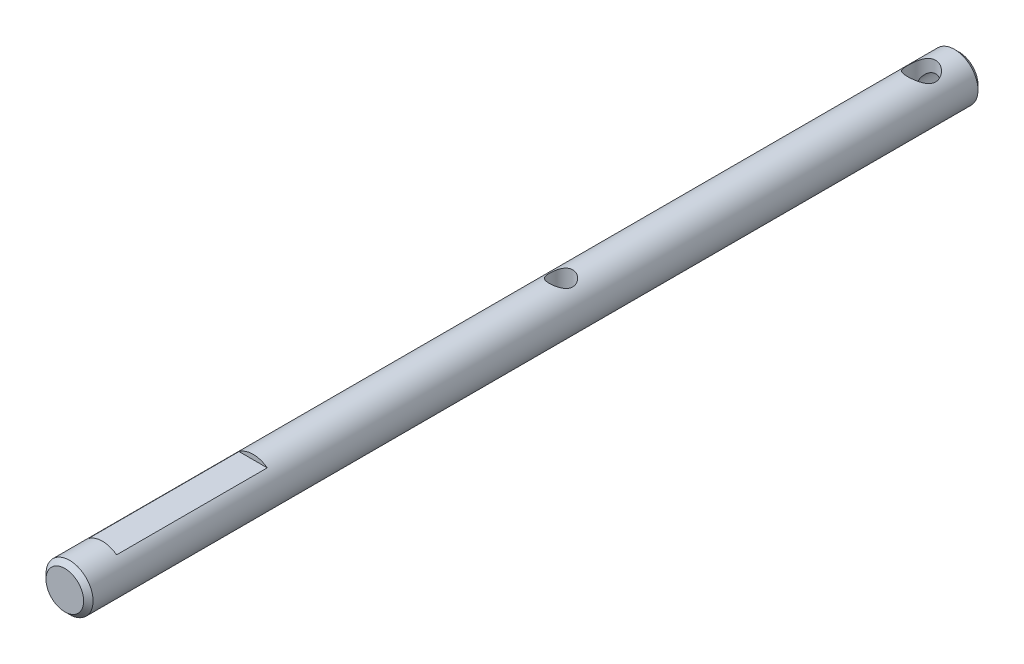
ISO-10303-21;
HEADER;
FILE_DESCRIPTION(('STEP AP214'),'2;1');
FILE_NAME('part.step','',(''),(''),'','','');
FILE_SCHEMA(('AUTOMOTIVE_DESIGN { 1 0 10303 214 1 1 1 1 }'));
ENDSEC;
DATA;
#1=APPLICATION_CONTEXT('core data for automotive mechanical design processes');
#2=APPLICATION_PROTOCOL_DEFINITION('international standard','automotive_design',2000,#1);
#3=PRODUCT_CONTEXT('',#1,'mechanical');
#4=PRODUCT('Part','Part','',(#3));
#5=PRODUCT_RELATED_PRODUCT_CATEGORY('part','',(#4));
#6=PRODUCT_DEFINITION_FORMATION('','',#4);
#7=PRODUCT_DEFINITION_CONTEXT('part definition',#1,'design');
#8=PRODUCT_DEFINITION('design','',#6,#7);
#9=PRODUCT_DEFINITION_SHAPE('','',#8);
#10=(LENGTH_UNIT() NAMED_UNIT(*) SI_UNIT(.MILLI.,.METRE.));
#11=(NAMED_UNIT(*) PLANE_ANGLE_UNIT() SI_UNIT($,.RADIAN.));
#12=(NAMED_UNIT(*) SI_UNIT($,.STERADIAN.) SOLID_ANGLE_UNIT());
#13=UNCERTAINTY_MEASURE_WITH_UNIT(LENGTH_MEASURE(1.E-05),#10,'distance_accuracy_value','');
#14=(GEOMETRIC_REPRESENTATION_CONTEXT(3) GLOBAL_UNCERTAINTY_ASSIGNED_CONTEXT((#13)) GLOBAL_UNIT_ASSIGNED_CONTEXT((#10,
#11,#12)) REPRESENTATION_CONTEXT('',''));
#15=CARTESIAN_POINT('',(0.,0.,0.));
#16=DIRECTION('',(0.,0.,1.));
#17=DIRECTION('',(1.,0.,0.));
#18=AXIS2_PLACEMENT_3D('',#15,#16,#17);
#19=CARTESIAN_POINT('',(0.,0.,0.));
#20=DIRECTION('',(0.,0.,1.));
#21=DIRECTION('',(1.,0.,0.));
#22=AXIS2_PLACEMENT_3D('',#19,#20,#21);
#23=PLANE('',#22);
#24=CARTESIAN_POINT('',(0.,0.,0.));
#25=DIRECTION('',(0.,0.,1.));
#26=DIRECTION('',(1.,0.,0.));
#27=AXIS2_PLACEMENT_3D('',#24,#25,#26);
#28=CIRCLE('',#27,2.);
#29=CARTESIAN_POINT('',(2.,0.,0.));
#30=VERTEX_POINT('',#29);
#31=EDGE_CURVE('E152',#30,#30,#28,.F.);
#32=ORIENTED_EDGE('',*,*,#31,.T.);
#33=EDGE_LOOP('',(#32));
#34=FACE_BOUND('',#33,.T.);
#35=CARTESIAN_POINT('',(0.,0.,0.));
#36=DIRECTION('',(0.,0.,-1.));
#37=DIRECTION('',(-1.,0.,0.));
#38=AXIS2_PLACEMENT_3D('',#35,#36,#37);
#39=CIRCLE('',#38,1.25);
#40=CARTESIAN_POINT('',(-1.25,0.,0.));
#41=VERTEX_POINT('',#40);
#42=EDGE_CURVE('E79',#41,#41,#39,.T.);
#43=ORIENTED_EDGE('',*,*,#42,.F.);
#44=EDGE_LOOP('',(#43));
#45=FACE_BOUND('',#44,.T.);
#46=ADVANCED_FACE('F37',(#34,#45),#23,.F.);
#47=CARTESIAN_POINT('',(0.,0.,95.));
#48=DIRECTION('',(0.,0.,-1.));
#49=DIRECTION('',(-1.,0.,0.));
#50=AXIS2_PLACEMENT_3D('',#47,#48,#49);
#51=CYLINDRICAL_SURFACE('',#50,2.5);
#52=CARTESIAN_POINT('',(0.,-2.5,43.55));
#53=CARTESIAN_POINT('',(0.0657149536912378,-2.49999641755188,43.5499958721006));
#54=CARTESIAN_POINT('',(0.131508249622545,-2.49738113774397,43.5447874085979));
#55=CARTESIAN_POINT('',(0.261150294085535,-2.48717695046745,43.5241838995738));
#56=CARTESIAN_POINT('',(0.324995108391883,-2.47957859786229,43.5087695087529));
#57=CARTESIAN_POINT('',(0.448666931100721,-2.46020349254139,43.468507739229));
#58=CARTESIAN_POINT('',(0.508508503673978,-2.448442989719,43.44369701969));
#59=CARTESIAN_POINT('',(0.623090771008207,-2.42182220644723,43.3855367232938));
#60=CARTESIAN_POINT('',(0.677831867487562,-2.40696217041912,43.3521878196889));
#61=CARTESIAN_POINT('',(0.784384772202399,-2.37445322822571,43.2756034381434));
#62=CARTESIAN_POINT('',(0.835819013902641,-2.3566899890942,43.2318919009504));
#63=CARTESIAN_POINT('',(0.930974306083723,-2.3207496280843,43.1368481509412));
#64=CARTESIAN_POINT('',(0.974689478883457,-2.30257220261294,43.0855101852844));
#65=CARTESIAN_POINT('',(1.05656500056285,-2.26623688996684,42.9718958130958));
#66=CARTESIAN_POINT('',(1.09403166943955,-2.24818983712665,42.9090798770676));
#67=CARTESIAN_POINT('',(1.15771028361337,-2.21607473465401,42.7770408300172));
#68=CARTESIAN_POINT('',(1.18393026870792,-2.20200384508737,42.7078223390966));
#69=CARTESIAN_POINT('',(1.22266555273573,-2.18072333797261,42.5691686182226));
#70=CARTESIAN_POINT('',(1.23590732135055,-2.17315339479642,42.4999944349157));
#71=CARTESIAN_POINT('',(1.25053374163606,-2.1647736243566,42.3600264527756));
#72=CARTESIAN_POINT('',(1.25193011046634,-2.1639571167911,42.289234323911));
#73=CARTESIAN_POINT('',(1.24335910896537,-2.16888662821561,42.1571424696058));
#74=CARTESIAN_POINT('',(1.23473069942102,-2.17385954577517,42.0957199609712));
#75=CARTESIAN_POINT('',(1.20867481132116,-2.18845285917313,41.9753476132837));
#76=CARTESIAN_POINT('',(1.19124452987206,-2.1980747353972,41.9163985683684));
#77=CARTESIAN_POINT('',(1.1477622254825,-2.22109345515926,41.8009635842929));
#78=CARTESIAN_POINT('',(1.12151883389499,-2.23457300829998,41.7445670015178));
#79=CARTESIAN_POINT('',(1.061302109585,-2.26379255351755,41.6367071342625));
#80=CARTESIAN_POINT('',(1.02732530476558,-2.27953355975238,41.5852460804999));
#81=CARTESIAN_POINT('',(0.947582568640984,-2.31391447379107,41.481848434071));
#82=CARTESIAN_POINT('',(0.900868072961601,-2.33266887795933,41.4306789080298));
#83=CARTESIAN_POINT('',(0.799444473426717,-2.36934529125509,41.3365807267614));
#84=CARTESIAN_POINT('',(0.744731570717859,-2.38726689948501,41.2936560099576));
#85=CARTESIAN_POINT('',(0.625645632289814,-2.42127484103705,41.2153929237128));
#86=CARTESIAN_POINT('',(0.560941989499263,-2.43723730202509,41.1804994094428));
#87=CARTESIAN_POINT('',(0.425582769360998,-2.46447351401553,41.1223787136962));
#88=CARTESIAN_POINT('',(0.354931970331598,-2.47575098679441,41.099142268731));
#89=CARTESIAN_POINT('',(0.21595811457588,-2.49155417176795,41.0669057453542));
#90=CARTESIAN_POINT('',(0.147926913185408,-2.4965617287664,41.0568859553165));
#91=CARTESIAN_POINT('',(0.0109744999366958,-2.50091266823877,41.0481690860819));
#92=CARTESIAN_POINT('',(-0.0579462748373724,-2.5002587340164,41.0494666429506));
#93=CARTESIAN_POINT('',(-0.189041214982487,-2.49363990316801,41.0627583605234));
#94=CARTESIAN_POINT('',(-0.251324260062437,-2.48809057110237,41.0739156659125));
#95=CARTESIAN_POINT('',(-0.37300861537739,-2.47277714143524,41.1052975898689));
#96=CARTESIAN_POINT('',(-0.43240960711374,-2.46301257917916,41.1255232080667));
#97=CARTESIAN_POINT('',(-0.548610760562076,-2.43980314267087,41.1749980830415));
#98=CARTESIAN_POINT('',(-0.605287996257686,-2.42626102212424,41.204488812646));
#99=CARTESIAN_POINT('',(-0.713076702123644,-2.39679967896386,41.2713844195576));
#100=CARTESIAN_POINT('',(-0.764185787219095,-2.38087944457232,41.3087926682418));
#101=CARTESIAN_POINT('',(-0.86470961161331,-2.34635276671831,41.3947005316661));
#102=CARTESIAN_POINT('',(-0.913465097280793,-2.32763606060552,41.443928585567));
#103=CARTESIAN_POINT('',(-1.00232040139154,-2.29077989504843,41.5499064390866));
#104=CARTESIAN_POINT('',(-1.04241423211354,-2.27264084226908,41.6066613985205));
#105=CARTESIAN_POINT('',(-1.11463489312211,-2.23813990282585,41.7295545677504));
#106=CARTESIAN_POINT('',(-1.14628186984829,-2.2219066207934,41.7960140827607));
#107=CARTESIAN_POINT('',(-1.19760353251724,-2.19467590460158,41.9343875846156));
#108=CARTESIAN_POINT('',(-1.21729364485945,-2.18367172800773,42.0062944081265));
#109=CARTESIAN_POINT('',(-1.24232710931209,-2.16951876260834,42.1461377785768));
#110=CARTESIAN_POINT('',(-1.24886624550107,-2.16571729325615,42.2137928167863));
#111=CARTESIAN_POINT('',(-1.25086144297597,-2.16456693307719,42.3493088339634));
#112=CARTESIAN_POINT('',(-1.24632230828049,-2.16721524534441,42.4171697109243));
#113=CARTESIAN_POINT('',(-1.22740765699032,-2.17797327562532,42.544354376915));
#114=CARTESIAN_POINT('',(-1.21401039292849,-2.18553868102993,42.6038755876805));
#115=CARTESIAN_POINT('',(-1.17896919778079,-2.20463770234898,42.7197601492809));
#116=CARTESIAN_POINT('',(-1.15732261394975,-2.21617259462095,42.7761224776149));
#117=CARTESIAN_POINT('',(-1.10476968162584,-2.24285662955661,42.8882810637333));
#118=CARTESIAN_POINT('',(-1.07333892227056,-2.25819652995239,42.9437848772871));
#119=CARTESIAN_POINT('',(-1.00268871454578,-2.29044164543238,43.0490931702257));
#120=CARTESIAN_POINT('',(-0.963465214048295,-2.30734767243153,43.0988946631481));
#121=CARTESIAN_POINT('',(-0.872754158330786,-2.34327903949142,43.197677477947));
#122=CARTESIAN_POINT('',(-0.8203555287627,-2.36231229139336,43.2458238779524));
#123=CARTESIAN_POINT('',(-0.707693507775336,-2.3984719031886,43.3328287292795));
#124=CARTESIAN_POINT('',(-0.647425904070967,-2.4155972326005,43.3716821742828));
#125=CARTESIAN_POINT('',(-0.519914496024918,-2.44622511981379,43.4390454534527));
#126=CARTESIAN_POINT('',(-0.452624379918253,-2.45970120703636,43.4674802117643));
#127=CARTESIAN_POINT('',(-0.313427626617725,-2.48126676704332,43.5122602098987));
#128=CARTESIAN_POINT('',(-0.241534749528946,-2.48937154216165,43.528639808537));
#129=CARTESIAN_POINT('',(-0.14075243310422,-2.49619327387079,43.5423717638448));
#130=CARTESIAN_POINT('',(-0.112702349299365,-2.49761706674002,43.5452283010795));
#131=CARTESIAN_POINT('',(-0.0564396647589401,-2.49952121222331,43.549043331896));
#132=CARTESIAN_POINT('',(-0.0282270595592207,-2.50000153879704,43.550001773089));
#133=CARTESIAN_POINT('',(0.,-2.5,43.55));
#134=B_SPLINE_CURVE_WITH_KNOTS('',3,(#52,#53,#54,#55,#56,#57,#58,#59,#60,#61,#62,#63,#64,#65,
#66,#67,#68,#69,#70,#71,#72,#73,#74,#75,#76,#77,#78,#79,#80,#81,#82,#83,#84,#85,#86,#87,#88,#89,
#90,#91,#92,#93,#94,#95,#96,#97,#98,#99,#100,#101,#102,#103,#104,#105,#106,#107,#108,#109,#110,
#111,#112,#113,#114,#115,#116,#117,#118,#119,#120,#121,#122,#123,#124,#125,#126,#127,#128,#129,
#130,#131,#132,#133),.UNSPECIFIED.,.T.,.F.,(4,2,2,2,2,2,2,2,2,2,2,2,2,2,2,2,2,2,2,2,2,2,2,2,2,2,
2,2,2,2,2,2,2,2,2,2,2,2,2,2,4),(0.,0.197030321775364,0.394435187136495,0.59107769436537,
0.787704700726955,0.996227198397605,1.20490779706754,1.4297715803844,1.65447434872851,
1.86572515175286,2.07676696661275,2.2625714051165,2.44843504907096,2.63862800210608,
2.82890651575276,3.04331176667347,3.25781918248356,3.48228777768049,3.70657771140348,
3.9122911308918,4.11790705639343,4.3075863313265,4.49728652038662,4.69241070034871,
4.88761813435421,5.10199513305521,5.31651985769287,5.5414335269959,5.76605639925969,
5.96911634372964,6.17208824825003,6.35572412805224,6.53941910979594,6.73545570969515,
6.93159451423694,7.15156553440619,7.37165479220712,7.59330017078653,7.81431135781158,
7.89894100172118,7.98357298143554),.UNSPECIFIED.);
#135=CARTESIAN_POINT('',(0.,-2.5,43.55));
#136=VERTEX_POINT('',#135);
#137=EDGE_CURVE('E11',#136,#136,#134,.T.);
#138=ORIENTED_EDGE('',*,*,#137,.T.);
#139=EDGE_LOOP('',(#138));
#140=FACE_BOUND('',#139,.T.);
#141=CARTESIAN_POINT('',(0.,2.5,43.55));
#142=CARTESIAN_POINT('',(-0.0657149536912274,2.49999641755189,43.5499958721006));
#143=CARTESIAN_POINT('',(-0.131508249622534,2.49738113774397,43.5447874085979));
#144=CARTESIAN_POINT('',(-0.261150294085524,2.48717695046745,43.5241838995738));
#145=CARTESIAN_POINT('',(-0.324995108391872,2.47957859786229,43.5087695087529));
#146=CARTESIAN_POINT('',(-0.44866693110071,2.4602034925414,43.468507739229));
#147=CARTESIAN_POINT('',(-0.508508503673967,2.448442989719,43.44369701969));
#148=CARTESIAN_POINT('',(-0.623090771008197,2.42182220644723,43.3855367232938));
#149=CARTESIAN_POINT('',(-0.677831867487552,2.40696217041913,43.3521878196889));
#150=CARTESIAN_POINT('',(-0.784384772202387,2.37445322822572,43.2756034381434));
#151=CARTESIAN_POINT('',(-0.835819013902628,2.3566899890942,43.2318919009504));
#152=CARTESIAN_POINT('',(-0.93097430608371,2.32074962808431,43.1368481509412));
#153=CARTESIAN_POINT('',(-0.974689478883446,2.30257220261294,43.0855101852844));
#154=CARTESIAN_POINT('',(-1.05656500056284,2.26623688996684,42.9718958130958));
#155=CARTESIAN_POINT('',(-1.09403166943954,2.24818983712665,42.9090798770676));
#156=CARTESIAN_POINT('',(-1.15771028361336,2.21607473465401,42.7770408300172));
#157=CARTESIAN_POINT('',(-1.18393026870791,2.20200384508738,42.7078223390966));
#158=CARTESIAN_POINT('',(-1.22266555273572,2.18072333797261,42.5691686182226));
#159=CARTESIAN_POINT('',(-1.23590732135054,2.17315339479643,42.4999944349157));
#160=CARTESIAN_POINT('',(-1.25053374163605,2.1647736243566,42.3600264527756));
#161=CARTESIAN_POINT('',(-1.25193011046633,2.16395711679111,42.289234323911));
#162=CARTESIAN_POINT('',(-1.24335910896536,2.16888662821561,42.1571424696058));
#163=CARTESIAN_POINT('',(-1.23473069942101,2.17385954577518,42.0957199609712));
#164=CARTESIAN_POINT('',(-1.20867481132115,2.18845285917314,41.9753476132837));
#165=CARTESIAN_POINT('',(-1.19124452987205,2.19807473539721,41.9163985683684));
#166=CARTESIAN_POINT('',(-1.14776222548249,2.22109345515927,41.8009635842929));
#167=CARTESIAN_POINT('',(-1.12151883389498,2.23457300829999,41.7445670015178));
#168=CARTESIAN_POINT('',(-1.06130210958499,2.26379255351755,41.6367071342625));
#169=CARTESIAN_POINT('',(-1.02732530476557,2.27953355975239,41.5852460804999));
#170=CARTESIAN_POINT('',(-0.947582568640972,2.31391447379108,41.481848434071));
#171=CARTESIAN_POINT('',(-0.900868072961588,2.33266887795933,41.4306789080298));
#172=CARTESIAN_POINT('',(-0.799444473426703,2.36934529125509,41.3365807267614));
#173=CARTESIAN_POINT('',(-0.744731570717844,2.38726689948501,41.2936560099576));
#174=CARTESIAN_POINT('',(-0.625645632289798,2.42127484103705,41.2153929237128));
#175=CARTESIAN_POINT('',(-0.560941989499248,2.43723730202509,41.1804994094428));
#176=CARTESIAN_POINT('',(-0.425582769360984,2.46447351401553,41.1223787136962));
#177=CARTESIAN_POINT('',(-0.354931970331586,2.47575098679441,41.099142268731));
#178=CARTESIAN_POINT('',(-0.215958114575869,2.49155417176795,41.0669057453542));
#179=CARTESIAN_POINT('',(-0.147926913185397,2.4965617287664,41.0568859553165));
#180=CARTESIAN_POINT('',(-0.0109744999366856,2.50091266823877,41.0481690860819));
#181=CARTESIAN_POINT('',(0.0579462748373821,2.5002587340164,41.0494666429506));
#182=CARTESIAN_POINT('',(0.189041214982496,2.49363990316801,41.0627583605234));
#183=CARTESIAN_POINT('',(0.251324260062447,2.48809057110237,41.0739156659125));
#184=CARTESIAN_POINT('',(0.373008615377399,2.47277714143524,41.1052975898689));
#185=CARTESIAN_POINT('',(0.432409607113748,2.46301257917915,41.1255232080667));
#186=CARTESIAN_POINT('',(0.548610760562084,2.43980314267087,41.1749980830415));
#187=CARTESIAN_POINT('',(0.605287996257696,2.42626102212424,41.204488812646));
#188=CARTESIAN_POINT('',(0.713076702123654,2.39679967896386,41.2713844195575));
#189=CARTESIAN_POINT('',(0.764185787219104,2.38087944457231,41.3087926682418));
#190=CARTESIAN_POINT('',(0.864709611613318,2.3463527667183,41.3947005316661));
#191=CARTESIAN_POINT('',(0.913465097280801,2.32763606060551,41.443928585567));
#192=CARTESIAN_POINT('',(1.00232040139155,2.29077989504843,41.5499064390866));
#193=CARTESIAN_POINT('',(1.04241423211355,2.27264084226908,41.6066613985205));
#194=CARTESIAN_POINT('',(1.11463489312212,2.23813990282585,41.7295545677504));
#195=CARTESIAN_POINT('',(1.1462818698483,2.2219066207934,41.7960140827607));
#196=CARTESIAN_POINT('',(1.19760353251725,2.19467590460158,41.9343875846156));
#197=CARTESIAN_POINT('',(1.21729364485946,2.18367172800773,42.0062944081265));
#198=CARTESIAN_POINT('',(1.2423271093121,2.16951876260833,42.1461377785768));
#199=CARTESIAN_POINT('',(1.24886624550108,2.16571729325614,42.2137928167863));
#200=CARTESIAN_POINT('',(1.25086144297598,2.16456693307719,42.3493088339634));
#201=CARTESIAN_POINT('',(1.2463223082805,2.16721524534441,42.4171697109243));
#202=CARTESIAN_POINT('',(1.22740765699033,2.17797327562531,42.544354376915));
#203=CARTESIAN_POINT('',(1.2140103929285,2.18553868102992,42.6038755876805));
#204=CARTESIAN_POINT('',(1.1789691977808,2.20463770234897,42.7197601492809));
#205=CARTESIAN_POINT('',(1.15732261394976,2.21617259462095,42.7761224776149));
#206=CARTESIAN_POINT('',(1.10476968162585,2.2428566295566,42.8882810637333));
#207=CARTESIAN_POINT('',(1.07333892227057,2.25819652995238,42.9437848772871));
#208=CARTESIAN_POINT('',(1.00268871454579,2.29044164543238,43.0490931702257));
#209=CARTESIAN_POINT('',(0.963465214048309,2.30734767243153,43.0988946631481));
#210=CARTESIAN_POINT('',(0.872754158330802,2.34327903949141,43.197677477947));
#211=CARTESIAN_POINT('',(0.820355528762714,2.36231229139336,43.2458238779524));
#212=CARTESIAN_POINT('',(0.70769350777535,2.3984719031886,43.3328287292795));
#213=CARTESIAN_POINT('',(0.647425904070983,2.4155972326005,43.3716821742828));
#214=CARTESIAN_POINT('',(0.519914496024936,2.44622511981379,43.4390454534527));
#215=CARTESIAN_POINT('',(0.45262437991827,2.45970120703636,43.4674802117643));
#216=CARTESIAN_POINT('',(0.313427626617742,2.48126676704332,43.5122602098987));
#217=CARTESIAN_POINT('',(0.241534749528961,2.48937154216165,43.5286398085369));
#218=CARTESIAN_POINT('',(0.140752433104235,2.49619327387079,43.5423717638448));
#219=CARTESIAN_POINT('',(0.112702349299379,2.49761706674002,43.5452283010795));
#220=CARTESIAN_POINT('',(0.0564396647589528,2.49952121222331,43.549043331896));
#221=CARTESIAN_POINT('',(0.0282270595592322,2.50000153879704,43.550001773089));
#222=CARTESIAN_POINT('',(0.,2.5,43.55));
#223=B_SPLINE_CURVE_WITH_KNOTS('',3,(#141,#142,#143,#144,#145,#146,#147,#148,#149,#150,#151,
#152,#153,#154,#155,#156,#157,#158,#159,#160,#161,#162,#163,#164,#165,#166,#167,#168,#169,#170,
#171,#172,#173,#174,#175,#176,#177,#178,#179,#180,#181,#182,#183,#184,#185,#186,#187,#188,#189,
#190,#191,#192,#193,#194,#195,#196,#197,#198,#199,#200,#201,#202,#203,#204,#205,#206,#207,#208,
#209,#210,#211,#212,#213,#214,#215,#216,#217,#218,#219,#220,#221,#222),.UNSPECIFIED.,.T.,.F.,(4,
2,2,2,2,2,2,2,2,2,2,2,2,2,2,2,2,2,2,2,2,2,2,2,2,2,2,2,2,2,2,2,2,2,2,2,2,2,2,2,4),(0.,
0.197030321775364,0.394435187136494,0.591077694365369,0.787704700726954,0.996227198397601,
1.20490779706754,1.4297715803844,1.6544743487285,1.86572515175286,2.07676696661275,
2.2625714051165,2.44843504907096,2.63862800210608,2.82890651575276,3.04331176667347,
3.25781918248356,3.48228777768049,3.70657771140347,3.9122911308918,4.11790705639342,
4.3075863313265,4.49728652038661,4.6924107003487,4.88761813435421,5.10199513305521,
5.31651985769287,5.5414335269959,5.76605639925969,5.96911634372964,6.17208824825003,
6.35572412805224,6.53941910979594,6.73545570969514,6.93159451423693,7.15156553440618,
7.37165479220712,7.59330017078652,7.81431135781158,7.89894100172117,7.98357298143554),.UNSPECIFIED.);
#224=CARTESIAN_POINT('',(0.,2.5,43.55));
#225=VERTEX_POINT('',#224);
#226=EDGE_CURVE('E85',#225,#225,#223,.T.);
#227=ORIENTED_EDGE('',*,*,#226,.T.);
#228=EDGE_LOOP('',(#227));
#229=FACE_BOUND('',#228,.T.);
#230=CARTESIAN_POINT('',(0.,0.,91.));
#231=DIRECTION('',(0.,0.,1.));
#232=DIRECTION('',(1.,0.,0.));
#233=AXIS2_PLACEMENT_3D('',#230,#231,#232);
#234=CIRCLE('',#233,2.5);
#235=CARTESIAN_POINT('',(1.5,2.,91.));
#236=VERTEX_POINT('',#235);
#237=CARTESIAN_POINT('',(-1.5,2.,91.));
#238=VERTEX_POINT('',#237);
#239=EDGE_CURVE('E64',#236,#238,#234,.T.);
#240=ORIENTED_EDGE('',*,*,#239,.T.);
#241=DIRECTION('',(0.,0.,-1.));
#242=VECTOR('',#241,1.);
#243=CARTESIAN_POINT('',(-1.5,2.,95.));
#244=LINE('',#243,#242);
#245=CARTESIAN_POINT('',(-1.5,2.,75.));
#246=VERTEX_POINT('',#245);
#247=EDGE_CURVE('E50',#238,#246,#244,.T.);
#248=ORIENTED_EDGE('',*,*,#247,.T.);
#249=CARTESIAN_POINT('',(0.,0.,75.));
#250=DIRECTION('',(0.,0.,-1.));
#251=DIRECTION('',(-1.,0.,0.));
#252=AXIS2_PLACEMENT_3D('',#249,#250,#251);
#253=CIRCLE('',#252,2.5);
#254=CARTESIAN_POINT('',(1.5,2.,75.));
#255=VERTEX_POINT('',#254);
#256=EDGE_CURVE('E72',#246,#255,#253,.T.);
#257=ORIENTED_EDGE('',*,*,#256,.T.);
#258=DIRECTION('',(0.,0.,-1.));
#259=VECTOR('',#258,1.);
#260=CARTESIAN_POINT('',(1.5,2.,95.));
#261=LINE('',#260,#259);
#262=EDGE_CURVE('E76',#255,#236,#261,.F.);
#263=ORIENTED_EDGE('',*,*,#262,.T.);
#264=EDGE_LOOP('',(#240,#248,#257,#263));
#265=FACE_BOUND('',#264,.T.);
#266=CARTESIAN_POINT('',(0.,0.,94.5));
#267=DIRECTION('',(0.,0.,1.));
#268=DIRECTION('',(1.,0.,0.));
#269=AXIS2_PLACEMENT_3D('',#266,#267,#268);
#270=CIRCLE('',#269,2.5);
#271=CARTESIAN_POINT('',(2.5,0.,94.5));
#272=VERTEX_POINT('',#271);
#273=EDGE_CURVE('E157',#272,#272,#270,.F.);
#274=ORIENTED_EDGE('',*,*,#273,.T.);
#275=EDGE_LOOP('',(#274));
#276=FACE_BOUND('',#275,.T.);
#277=CARTESIAN_POINT('',(0.,0.,0.499999999999987));
#278=DIRECTION('',(0.,0.,1.));
#279=DIRECTION('',(1.,0.,0.));
#280=AXIS2_PLACEMENT_3D('',#277,#278,#279);
#281=CIRCLE('',#280,2.5);
#282=CARTESIAN_POINT('',(2.5,0.,0.499999999999987));
#283=VERTEX_POINT('',#282);
#284=EDGE_CURVE('E161',#283,#283,#281,.T.);
#285=ORIENTED_EDGE('',*,*,#284,.T.);
#286=EDGE_LOOP('',(#285));
#287=FACE_BOUND('',#286,.T.);
#288=CARTESIAN_POINT('',(0.,-2.5,5.5));
#289=CARTESIAN_POINT('',(0.0767298334620158,-2.49999625789732,5.49999590899012));
#290=CARTESIAN_POINT('',(0.153582320644178,-2.4964290461501,5.49407132907374));
#291=CARTESIAN_POINT('',(0.304975509530679,-2.48249903608568,5.47067568048467));
#292=CARTESIAN_POINT('',(0.379510034596047,-2.47211948032719,5.45317613814578));
#293=CARTESIAN_POINT('',(0.523751827790837,-2.44561558054488,5.40761363883314));
#294=CARTESIAN_POINT('',(0.593481028226566,-2.42951973272944,5.37960304183684));
#295=CARTESIAN_POINT('',(0.727030318214659,-2.39295367626407,5.31413966685897));
#296=CARTESIAN_POINT('',(0.790851869416383,-2.37248455380255,5.27668923303125));
#297=CARTESIAN_POINT('',(0.916299278999315,-2.32705360719088,5.19022517329142));
#298=CARTESIAN_POINT('',(0.977384020081415,-2.30186792195985,5.14054630464861));
#299=CARTESIAN_POINT('',(1.09088270411891,-2.25030439279634,5.03253279617173));
#300=CARTESIAN_POINT('',(1.14328534948112,-2.22392505153571,4.97418706281268));
#301=CARTESIAN_POINT('',(1.24444996762974,-2.1691106699591,4.84207648950327));
#302=CARTESIAN_POINT('',(1.29197766378809,-2.14082017703649,4.76729822901871));
#303=CARTESIAN_POINT('',(1.37361437764896,-2.08938301412124,4.60915342675689));
#304=CARTESIAN_POINT('',(1.4077451733516,-2.06622802273938,4.52580110375243));
#305=CARTESIAN_POINT('',(1.45440601714222,-2.0335462966093,4.37340354934676));
#306=CARTESIAN_POINT('',(1.47016197246826,-2.02207883137591,4.30576400138968));
#307=CARTESIAN_POINT('',(1.49216172340475,-2.00590308295503,4.16819628416964));
#308=CARTESIAN_POINT('',(1.49841734556836,-2.00118639643759,4.09827107124551));
#309=CARTESIAN_POINT('',(1.50105508796009,-1.99920922463856,3.95798850578266));
#310=CARTESIAN_POINT('',(1.49741783408419,-2.00196337012718,3.8876305749068));
#311=CARTESIAN_POINT('',(1.48046060478828,-2.01453261443741,3.74872122457241));
#312=CARTESIAN_POINT('',(1.46713334620103,-2.02435302432226,3.68017120415256));
#313=CARTESIAN_POINT('',(1.43173921881792,-2.04953186944258,3.5474697578719));
#314=CARTESIAN_POINT('',(1.40978748666087,-2.06481711652537,3.48327294607552));
#315=CARTESIAN_POINT('',(1.35795061770837,-2.09927051350828,3.35930500907188));
#316=CARTESIAN_POINT('',(1.32806257259705,-2.11844008623465,3.29953551657608));
#317=CARTESIAN_POINT('',(1.25517983184583,-2.16255327268985,3.1750159028772));
#318=CARTESIAN_POINT('',(1.21080724397723,-2.18792043372992,3.11122190704507));
#319=CARTESIAN_POINT('',(1.11291092784003,-2.23930599764381,2.99132351633299));
#320=CARTESIAN_POINT('',(1.05937845100579,-2.26532500262149,2.93522656602349));
#321=CARTESIAN_POINT('',(0.935811834382967,-2.31935504958317,2.82438701817824));
#322=CARTESIAN_POINT('',(0.864517682704957,-2.34713836268532,2.77092269398401));
#323=CARTESIAN_POINT('',(0.712276050459,-2.3977242843398,2.67687795280209));
#324=CARTESIAN_POINT('',(0.631333763943564,-2.42052955425515,2.63629064621005));
#325=CARTESIAN_POINT('',(0.467197585268206,-2.45730392066151,2.5720678172041));
#326=CARTESIAN_POINT('',(0.384467624173581,-2.47173957439704,2.54752464428409));
#327=CARTESIAN_POINT('',(0.21504789514464,-2.4921884281355,2.51298880259462));
#328=CARTESIAN_POINT('',(0.12836300566132,-2.49821172952738,2.50297868224642));
#329=CARTESIAN_POINT('',(-0.0337146143773959,-2.5009057037461,2.49849215232169));
#330=CARTESIAN_POINT('',(-0.109042473418717,-2.49873521714286,2.50209114491483));
#331=CARTESIAN_POINT('',(-0.25782940198606,-2.48778712087048,2.52042585307192));
#332=CARTESIAN_POINT('',(-0.331288509376105,-2.47900964518037,2.53516134280581));
#333=CARTESIAN_POINT('',(-0.472574932157612,-2.4559479244219,2.57454343281246));
#334=CARTESIAN_POINT('',(-0.540495750928483,-2.44180275662555,2.59894034907347));
#335=CARTESIAN_POINT('',(-0.671265749087262,-2.40913880862844,2.65667737636527));
#336=CARTESIAN_POINT('',(-0.734113924963908,-2.39061916586511,2.69001925134667));
#337=CARTESIAN_POINT('',(-0.860006262823863,-2.3484549623736,2.7685569792087));
#338=CARTESIAN_POINT('',(-0.922394150456837,-2.3244780273988,2.81462382907839));
#339=CARTESIAN_POINT('',(-1.03902603131014,-2.27474265574731,2.91539139348862));
#340=CARTESIAN_POINT('',(-1.09326040273738,-2.2489821658636,2.97010215485254));
#341=CARTESIAN_POINT('',(-1.19931996735579,-2.19445423909891,3.09491039003715));
#342=CARTESIAN_POINT('',(-1.24991019630915,-2.16573241746291,3.1660838854655));
#343=CARTESIAN_POINT('',(-1.33845238915667,-2.1121618206671,3.3172160245682));
#344=CARTESIAN_POINT('',(-1.37641766769781,-2.0873089799769,3.39716529389278));
#345=CARTESIAN_POINT('',(-1.43142578795776,-2.04984909240519,3.54624302230669));
#346=CARTESIAN_POINT('',(-1.4512162533619,-2.03575659328729,3.61398031235859));
#347=CARTESIAN_POINT('',(-1.48113663905972,-2.01409605743544,3.7525320780801));
#348=CARTESIAN_POINT('',(-1.49127995297631,-2.00651897642721,3.82334214432783));
#349=CARTESIAN_POINT('',(-1.50134130416631,-1.99900446616267,3.96637694759703));
#350=CARTESIAN_POINT('',(-1.50122089107869,-1.99909576445937,4.03860599068704));
#351=CARTESIAN_POINT('',(-1.49066472959328,-2.0069771789285,4.18189443560946));
#352=CARTESIAN_POINT('',(-1.48022337215759,-2.0147714813882,4.2529531800806));
#353=CARTESIAN_POINT('',(-1.45040174148913,-2.0363318524298,4.38848841757219));
#354=CARTESIAN_POINT('',(-1.43147636845351,-2.0497921180558,4.45311709430687));
#355=CARTESIAN_POINT('',(-1.38563242076993,-2.08105501960151,4.57833725447422));
#356=CARTESIAN_POINT('',(-1.35871083588479,-2.09885929040482,4.63892720696055));
#357=CARTESIAN_POINT('',(-1.29289245555732,-2.14012990550917,4.76431985722078));
#358=CARTESIAN_POINT('',(-1.25279167675753,-2.16404587582639,4.82834110385431));
#359=CARTESIAN_POINT('',(-1.16375698389085,-2.21320127030768,4.94938007261729));
#360=CARTESIAN_POINT('',(-1.11481579607798,-2.23844177205021,5.00639196215256));
#361=CARTESIAN_POINT('',(-1.00009777425734,-2.29225690291476,5.12135094913167));
#362=CARTESIAN_POINT('',(-0.932876819313905,-2.32070308663658,5.17793107489619));
#363=CARTESIAN_POINT('',(-0.788462434445589,-2.37365428872367,5.27909785586331));
#364=CARTESIAN_POINT('',(-0.71126544450154,-2.39815789310936,5.32368021198479));
#365=CARTESIAN_POINT('',(-0.551125230801454,-2.43985578654394,5.39778580757374));
#366=CARTESIAN_POINT('',(-0.468430086957214,-2.45725077479787,5.42772806492683));
#367=CARTESIAN_POINT('',(-0.297973306118808,-2.48366273001246,5.47272469521098));
#368=CARTESIAN_POINT('',(-0.210232099648613,-2.49271125871485,5.48783516785699));
#369=CARTESIAN_POINT('',(-0.101558096917537,-2.49802001168187,5.49669745470866));
#370=CARTESIAN_POINT('',(-0.0812762590282778,-2.49876114656362,5.4979344173061));
#371=CARTESIAN_POINT('',(-0.0406658206871125,-2.49975164517367,5.49958624637086));
#372=CARTESIAN_POINT('',(-0.0203372186375695,-2.50000099184316,5.5000010843209));
#373=CARTESIAN_POINT('',(0.,-2.5,5.5));
#374=B_SPLINE_CURVE_WITH_KNOTS('',3,(#288,#289,#290,#291,#292,#293,#294,#295,#296,#297,#298,
#299,#300,#301,#302,#303,#304,#305,#306,#307,#308,#309,#310,#311,#312,#313,#314,#315,#316,#317,
#318,#319,#320,#321,#322,#323,#324,#325,#326,#327,#328,#329,#330,#331,#332,#333,#334,#335,#336,
#337,#338,#339,#340,#341,#342,#343,#344,#345,#346,#347,#348,#349,#350,#351,#352,#353,#354,#355,
#356,#357,#358,#359,#360,#361,#362,#363,#364,#365,#366,#367,#368,#369,#370,#371,#372,#373),
.UNSPECIFIED.,.T.,.F.,(4,2,2,2,2,2,2,2,2,2,2,2,2,2,2,2,2,2,2,2,2,2,2,2,2,2,2,2,2,2,2,2,2,2,2,2,
2,2,2,2,2,2,4),(0.,0.230102237548649,0.460772627520012,0.690308884600012,0.919788197992275,
1.16681590732473,1.414162579348,1.69183813189807,1.96906040692092,2.17933829855633,
2.38935420916578,2.59978170870726,2.81036753273872,3.01823267593207,3.22617409809868,
3.47046995225163,3.71500044803674,3.99360957884691,4.27206939275324,4.53296790696559,
4.79355286918236,5.01875602722426,5.24395461863455,5.46367785689772,5.68344445659025,
5.92601365818362,6.16886690081836,6.44336762428009,6.71757792616456,6.93257787314692,
7.14727888733318,7.36278425777433,7.57840681155725,7.78364098331142,7.98895251523035,
8.22578610052286,8.46281544370207,8.73854311775519,9.01436946031985,9.28175654462677,
9.54812832184448,9.60911473335177,9.6701032602764),.UNSPECIFIED.);
#375=CARTESIAN_POINT('',(0.,-2.5,5.5));
#376=VERTEX_POINT('',#375);
#377=EDGE_CURVE('E128',#376,#376,#374,.T.);
#378=ORIENTED_EDGE('',*,*,#377,.T.);
#379=EDGE_LOOP('',(#378));
#380=FACE_BOUND('',#379,.T.);
#381=CARTESIAN_POINT('',(0.,2.5,5.5));
#382=CARTESIAN_POINT('',(-0.0767298334620158,2.49999625789732,5.49999590899012));
#383=CARTESIAN_POINT('',(-0.153582320644178,2.4964290461501,5.49407132907374));
#384=CARTESIAN_POINT('',(-0.304975509530679,2.48249903608568,5.47067568048467));
#385=CARTESIAN_POINT('',(-0.379510034596047,2.47211948032719,5.45317613814578));
#386=CARTESIAN_POINT('',(-0.523751827790837,2.44561558054488,5.40761363883314));
#387=CARTESIAN_POINT('',(-0.593481028226566,2.42951973272944,5.37960304183684));
#388=CARTESIAN_POINT('',(-0.727030318214659,2.39295367626407,5.31413966685897));
#389=CARTESIAN_POINT('',(-0.790851869416383,2.37248455380255,5.27668923303125));
#390=CARTESIAN_POINT('',(-0.916299278999315,2.32705360719088,5.19022517329142));
#391=CARTESIAN_POINT('',(-0.977384020081415,2.30186792195985,5.14054630464861));
#392=CARTESIAN_POINT('',(-1.09088270411891,2.25030439279634,5.03253279617173));
#393=CARTESIAN_POINT('',(-1.14328534948112,2.22392505153571,4.97418706281268));
#394=CARTESIAN_POINT('',(-1.24444996762974,2.1691106699591,4.84207648950327));
#395=CARTESIAN_POINT('',(-1.29197766378809,2.14082017703649,4.76729822901871));
#396=CARTESIAN_POINT('',(-1.37361437764896,2.08938301412124,4.60915342675689));
#397=CARTESIAN_POINT('',(-1.4077451733516,2.06622802273938,4.52580110375243));
#398=CARTESIAN_POINT('',(-1.45440601714222,2.0335462966093,4.37340354934676));
#399=CARTESIAN_POINT('',(-1.47016197246826,2.02207883137591,4.30576400138968));
#400=CARTESIAN_POINT('',(-1.49216172340475,2.00590308295503,4.16819628416964));
#401=CARTESIAN_POINT('',(-1.49841734556836,2.00118639643759,4.09827107124551));
#402=CARTESIAN_POINT('',(-1.50105508796009,1.99920922463856,3.95798850578266));
#403=CARTESIAN_POINT('',(-1.49741783408419,2.00196337012718,3.8876305749068));
#404=CARTESIAN_POINT('',(-1.48046060478828,2.01453261443741,3.74872122457241));
#405=CARTESIAN_POINT('',(-1.46713334620103,2.02435302432226,3.68017120415256));
#406=CARTESIAN_POINT('',(-1.43173921881792,2.04953186944258,3.5474697578719));
#407=CARTESIAN_POINT('',(-1.40978748666087,2.06481711652537,3.48327294607552));
#408=CARTESIAN_POINT('',(-1.35795061770837,2.09927051350828,3.35930500907188));
#409=CARTESIAN_POINT('',(-1.32806257259705,2.11844008623465,3.29953551657608));
#410=CARTESIAN_POINT('',(-1.25517983184583,2.16255327268985,3.1750159028772));
#411=CARTESIAN_POINT('',(-1.21080724397723,2.18792043372992,3.11122190704507));
#412=CARTESIAN_POINT('',(-1.11291092784003,2.23930599764381,2.99132351633299));
#413=CARTESIAN_POINT('',(-1.05937845100579,2.26532500262149,2.93522656602349));
#414=CARTESIAN_POINT('',(-0.935811834382967,2.31935504958317,2.82438701817824));
#415=CARTESIAN_POINT('',(-0.864517682704957,2.34713836268532,2.77092269398401));
#416=CARTESIAN_POINT('',(-0.712276050459,2.3977242843398,2.67687795280209));
#417=CARTESIAN_POINT('',(-0.631333763943564,2.42052955425515,2.63629064621005));
#418=CARTESIAN_POINT('',(-0.467197585268206,2.45730392066151,2.5720678172041));
#419=CARTESIAN_POINT('',(-0.384467624173581,2.47173957439704,2.54752464428409));
#420=CARTESIAN_POINT('',(-0.21504789514464,2.4921884281355,2.51298880259462));
#421=CARTESIAN_POINT('',(-0.12836300566132,2.49821172952738,2.50297868224642));
#422=CARTESIAN_POINT('',(0.0337146143773959,2.5009057037461,2.49849215232169));
#423=CARTESIAN_POINT('',(0.109042473418717,2.49873521714286,2.50209114491483));
#424=CARTESIAN_POINT('',(0.25782940198606,2.48778712087048,2.52042585307192));
#425=CARTESIAN_POINT('',(0.331288509376105,2.47900964518037,2.53516134280581));
#426=CARTESIAN_POINT('',(0.472574932157612,2.4559479244219,2.57454343281246));
#427=CARTESIAN_POINT('',(0.540495750928483,2.44180275662555,2.59894034907347));
#428=CARTESIAN_POINT('',(0.671265749087262,2.40913880862844,2.65667737636527));
#429=CARTESIAN_POINT('',(0.734113924963908,2.39061916586511,2.69001925134667));
#430=CARTESIAN_POINT('',(0.860006262823863,2.3484549623736,2.7685569792087));
#431=CARTESIAN_POINT('',(0.922394150456837,2.3244780273988,2.81462382907839));
#432=CARTESIAN_POINT('',(1.03902603131014,2.27474265574731,2.91539139348862));
#433=CARTESIAN_POINT('',(1.09326040273738,2.2489821658636,2.97010215485254));
#434=CARTESIAN_POINT('',(1.19931996735579,2.19445423909891,3.09491039003715));
#435=CARTESIAN_POINT('',(1.24991019630915,2.16573241746291,3.1660838854655));
#436=CARTESIAN_POINT('',(1.33845238915667,2.1121618206671,3.3172160245682));
#437=CARTESIAN_POINT('',(1.37641766769781,2.0873089799769,3.39716529389278));
#438=CARTESIAN_POINT('',(1.43142578795776,2.04984909240519,3.54624302230669));
#439=CARTESIAN_POINT('',(1.4512162533619,2.03575659328729,3.61398031235859));
#440=CARTESIAN_POINT('',(1.48113663905972,2.01409605743544,3.7525320780801));
#441=CARTESIAN_POINT('',(1.49127995297631,2.00651897642721,3.82334214432783));
#442=CARTESIAN_POINT('',(1.50134130416631,1.99900446616267,3.96637694759703));
#443=CARTESIAN_POINT('',(1.50122089107869,1.99909576445937,4.03860599068704));
#444=CARTESIAN_POINT('',(1.49066472959328,2.0069771789285,4.18189443560946));
#445=CARTESIAN_POINT('',(1.48022337215759,2.0147714813882,4.2529531800806));
#446=CARTESIAN_POINT('',(1.45040174148913,2.0363318524298,4.38848841757219));
#447=CARTESIAN_POINT('',(1.43147636845351,2.0497921180558,4.45311709430687));
#448=CARTESIAN_POINT('',(1.38563242076993,2.08105501960151,4.57833725447422));
#449=CARTESIAN_POINT('',(1.35871083588479,2.09885929040482,4.63892720696055));
#450=CARTESIAN_POINT('',(1.29289245555732,2.14012990550917,4.76431985722078));
#451=CARTESIAN_POINT('',(1.25279167675753,2.16404587582639,4.82834110385431));
#452=CARTESIAN_POINT('',(1.16375698389085,2.21320127030768,4.94938007261729));
#453=CARTESIAN_POINT('',(1.11481579607798,2.23844177205021,5.00639196215256));
#454=CARTESIAN_POINT('',(1.00009777425734,2.29225690291476,5.12135094913167));
#455=CARTESIAN_POINT('',(0.932876819313905,2.32070308663658,5.17793107489619));
#456=CARTESIAN_POINT('',(0.788462434445589,2.37365428872367,5.27909785586331));
#457=CARTESIAN_POINT('',(0.71126544450154,2.39815789310936,5.32368021198479));
#458=CARTESIAN_POINT('',(0.551125230801454,2.43985578654394,5.39778580757374));
#459=CARTESIAN_POINT('',(0.468430086957214,2.45725077479787,5.42772806492683));
#460=CARTESIAN_POINT('',(0.297973306118808,2.48366273001246,5.47272469521098));
#461=CARTESIAN_POINT('',(0.210232099648613,2.49271125871485,5.48783516785699));
#462=CARTESIAN_POINT('',(0.101558096917537,2.49802001168187,5.49669745470866));
#463=CARTESIAN_POINT('',(0.0812762590282778,2.49876114656362,5.4979344173061));
#464=CARTESIAN_POINT('',(0.0406658206871125,2.49975164517367,5.49958624637086));
#465=CARTESIAN_POINT('',(0.0203372186375695,2.50000099184316,5.5000010843209));
#466=CARTESIAN_POINT('',(0.,2.5,5.5));
#467=B_SPLINE_CURVE_WITH_KNOTS('',3,(#381,#382,#383,#384,#385,#386,#387,#388,#389,#390,#391,
#392,#393,#394,#395,#396,#397,#398,#399,#400,#401,#402,#403,#404,#405,#406,#407,#408,#409,#410,
#411,#412,#413,#414,#415,#416,#417,#418,#419,#420,#421,#422,#423,#424,#425,#426,#427,#428,#429,
#430,#431,#432,#433,#434,#435,#436,#437,#438,#439,#440,#441,#442,#443,#444,#445,#446,#447,#448,
#449,#450,#451,#452,#453,#454,#455,#456,#457,#458,#459,#460,#461,#462,#463,#464,#465,#466),
.UNSPECIFIED.,.T.,.F.,(4,2,2,2,2,2,2,2,2,2,2,2,2,2,2,2,2,2,2,2,2,2,2,2,2,2,2,2,2,2,2,2,2,2,2,2,
2,2,2,2,2,2,4),(0.,0.230102237548649,0.460772627520012,0.690308884600012,0.919788197992275,
1.16681590732473,1.414162579348,1.69183813189807,1.96906040692092,2.17933829855633,
2.38935420916578,2.59978170870726,2.81036753273872,3.01823267593207,3.22617409809868,
3.47046995225163,3.71500044803674,3.99360957884691,4.27206939275324,4.53296790696559,
4.79355286918236,5.01875602722426,5.24395461863455,5.46367785689772,5.68344445659025,
5.92601365818362,6.16886690081836,6.44336762428009,6.71757792616456,6.93257787314692,
7.14727888733318,7.36278425777433,7.57840681155725,7.78364098331142,7.98895251523035,
8.22578610052286,8.46281544370207,8.73854311775519,9.01436946031985,9.28175654462677,
9.54812832184448,9.60911473335177,9.6701032602764),.UNSPECIFIED.);
#468=CARTESIAN_POINT('',(0.,2.5,5.5));
#469=VERTEX_POINT('',#468);
#470=EDGE_CURVE('E121',#469,#469,#467,.T.);
#471=ORIENTED_EDGE('',*,*,#470,.T.);
#472=EDGE_LOOP('',(#471));
#473=FACE_BOUND('',#472,.T.);
#474=ADVANCED_FACE('F81',(#140,#229,#265,#276,#287,#380,#473),#51,.T.);
#475=CARTESIAN_POINT('',(0.,0.,95.));
#476=DIRECTION('',(0.,0.,1.));
#477=DIRECTION('',(1.,0.,0.));
#478=AXIS2_PLACEMENT_3D('',#475,#476,#477);
#479=PLANE('',#478);
#480=CARTESIAN_POINT('',(0.,0.,95.));
#481=DIRECTION('',(0.,0.,1.));
#482=DIRECTION('',(1.,0.,0.));
#483=AXIS2_PLACEMENT_3D('',#480,#481,#482);
#484=CIRCLE('',#483,2.);
#485=CARTESIAN_POINT('',(2.,0.,95.));
#486=VERTEX_POINT('',#485);
#487=EDGE_CURVE('E165',#486,#486,#484,.T.);
#488=ORIENTED_EDGE('',*,*,#487,.T.);
#489=EDGE_LOOP('',(#488));
#490=FACE_BOUND('',#489,.T.);
#491=ADVANCED_FACE('F138',(#490),#479,.T.);
#492=CARTESIAN_POINT('',(0.,-2.5,4.));
#493=DIRECTION('',(0.,1.,0.));
#494=DIRECTION('',(0.,0.,1.));
#495=AXIS2_PLACEMENT_3D('',#492,#493,#494);
#496=CYLINDRICAL_SURFACE('',#495,1.5);
#497=CARTESIAN_POINT('',(-1.25,0.,3.17084380241115));
#498=CARTESIAN_POINT('',(-1.24999404087226,0.0441647053802051,3.17082891926615));
#499=CARTESIAN_POINT('',(-1.24763049967423,0.0883835212201901,3.16723762460473));
#500=CARTESIAN_POINT('',(-1.23841578381773,0.175385301246376,3.15360370957297));
#501=CARTESIAN_POINT('',(-1.23154918841669,0.218162798455738,3.14353892296688));
#502=CARTESIAN_POINT('',(-1.21043365494066,0.317555432998842,3.11383370401918));
#503=CARTESIAN_POINT('',(-1.19435434755409,0.37310208001594,3.09199333353366));
#504=CARTESIAN_POINT('',(-1.15573690008527,0.479582635118992,3.04331603213368));
#505=CARTESIAN_POINT('',(-1.13317786130272,0.530500904551062,3.01646303400793));
#506=CARTESIAN_POINT('',(-1.070817065168,0.649758375080354,2.94817856063593));
#507=CARTESIAN_POINT('',(-1.02781025867357,0.715759854104527,2.90557954954474));
#508=CARTESIAN_POINT('',(-0.929991014491962,0.838915099285456,2.82131373519881));
#509=CARTESIAN_POINT('',(-0.875189620049185,0.896077056411169,2.77964609991081));
#510=CARTESIAN_POINT('',(-0.766663658737559,0.989290116607651,2.70946742907497));
#511=CARTESIAN_POINT('',(-0.71517630715202,1.02724727919612,2.68004041565372));
#512=CARTESIAN_POINT('',(-0.605134546053411,1.09567035779853,2.62611859133512));
#513=CARTESIAN_POINT('',(-0.54659181589745,1.12614840737724,2.6016158035872));
#514=CARTESIAN_POINT('',(-0.433965688541278,1.173556063108,2.56313587735471));
#515=CARTESIAN_POINT('',(-0.380860387543682,1.19191688378329,2.54807147877227));
#516=CARTESIAN_POINT('',(-0.271416974505908,1.2214903033312,2.52369795456787));
#517=CARTESIAN_POINT('',(-0.215080746020964,1.23270702178971,2.51438551222302));
#518=CARTESIAN_POINT('',(-0.10045312980402,1.2473007228839,2.50225423266368));
#519=CARTESIAN_POINT('',(-0.0421545865612108,1.25064491421972,2.49946255665711));
#520=CARTESIAN_POINT('',(0.0742637120693294,1.24914887809637,2.5007092809125));
#521=CARTESIAN_POINT('',(0.132383471389193,1.24430883194758,2.50474752986699));
#522=CARTESIAN_POINT('',(0.242722987690763,1.22739289605121,2.51879329411054));
#523=CARTESIAN_POINT('',(0.295076907899646,1.21582452214335,2.52838192556952));
#524=CARTESIAN_POINT('',(0.396813223309237,1.18652600330558,2.55249354007));
#525=CARTESIAN_POINT('',(0.446195191050168,1.16879497446605,2.56701723094042));
#526=CARTESIAN_POINT('',(0.54526644151665,1.12620474375288,2.60154805860195));
#527=CARTESIAN_POINT('',(0.594620394489258,1.10086539417456,2.6219180831559));
#528=CARTESIAN_POINT('',(0.6883910713592,1.04480037361997,2.66627779604116));
#529=CARTESIAN_POINT('',(0.732803298534894,1.0140698614123,2.69027073500746));
#530=CARTESIAN_POINT('',(0.836393722531951,0.932277408485258,2.75274716607078));
#531=CARTESIAN_POINT('',(0.892549793915362,0.878496609606196,2.79269558274728));
#532=CARTESIAN_POINT('',(0.99363852917749,0.762324431149106,2.8744320285411));
#533=CARTESIAN_POINT('',(1.03855119382815,0.699918010395097,2.91622318235302));
#534=CARTESIAN_POINT('',(1.10642031272616,0.58441929350592,2.98632160354382));
#535=CARTESIAN_POINT('',(1.13203948271785,0.533262544824508,3.01525953415329));
#536=CARTESIAN_POINT('',(1.17656863192196,0.426075053463699,3.06893029049295));
#537=CARTESIAN_POINT('',(1.19549764866108,0.370058715142942,3.09367494231248));
#538=CARTESIAN_POINT('',(1.2207056855963,0.272088935780562,3.12811702816862));
#539=CARTESIAN_POINT('',(1.22909685175358,0.231500382128687,3.14009027576882));
#540=CARTESIAN_POINT('',(1.24185130532595,0.148519669318798,3.1586116339734));
#541=CARTESIAN_POINT('',(1.24622406437787,0.106131999024746,3.16517249814673));
#542=CARTESIAN_POINT('',(1.25057759306023,0.0202860122865599,3.1717034714987));
#543=CARTESIAN_POINT('',(1.25052664975154,-0.0231778013351489,3.17162599131433));
#544=CARTESIAN_POINT('',(1.24595802348496,-0.109352549346469,3.16477421705254));
#545=CARTESIAN_POINT('',(1.2414341556627,-0.152062357912819,3.15799065024388));
#546=CARTESIAN_POINT('',(1.22668003680201,-0.246093535711988,3.13660087174003));
#547=CARTESIAN_POINT('',(1.21529777259545,-0.296867910394467,3.1204524815076));
#548=CARTESIAN_POINT('',(1.18711365735935,-0.394810778996185,3.08276725298006));
#549=CARTESIAN_POINT('',(1.17029389583343,-0.441966710058019,3.06121266060808));
#550=CARTESIAN_POINT('',(1.12091579801675,-0.558610630308456,3.00213137893539));
#551=CARTESIAN_POINT('',(1.08484810385271,-0.625535470450643,2.96249587822855));
#552=CARTESIAN_POINT('',(1.0017702868871,-0.751426283670896,2.88204041713734));
#553=CARTESIAN_POINT('',(0.954744311539846,-0.810380529146541,2.84121881651703));
#554=CARTESIAN_POINT('',(0.848446129663131,-0.921239460412229,2.76117669048615));
#555=CARTESIAN_POINT('',(0.788892937369293,-0.972926776473875,2.72202326983727));
#556=CARTESIAN_POINT('',(0.65855481189519,-1.06542925120827,2.65025999486928));
#557=CARTESIAN_POINT('',(0.587808772156698,-1.10628079315959,2.61762833582044));
#558=CARTESIAN_POINT('',(0.461595088972362,-1.16297173570474,2.57177407890028));
#559=CARTESIAN_POINT('',(0.408859439024256,-1.1826119113434,2.55570492966536));
#560=CARTESIAN_POINT('',(0.299904276444411,-1.21481462754323,2.52922148442512));
#561=CARTESIAN_POINT('',(0.243687513640116,-1.22738267736314,2.5188027868895));
#562=CARTESIAN_POINT('',(0.128950522663658,-1.24468952077125,2.50443035097176));
#563=CARTESIAN_POINT('',(0.070420571175018,-1.24939061588977,2.50050774279369));
#564=CARTESIAN_POINT('',(-0.0467748285323677,-1.25049755743498,2.49958544545991));
#565=CARTESIAN_POINT('',(-0.105440266542957,-1.24690400967706,2.50258525071224));
#566=CARTESIAN_POINT('',(-0.216739569352155,-1.23225255861178,2.51476205772581));
#567=CARTESIAN_POINT('',(-0.269501624532628,-1.22175707606132,2.52347348556603));
#568=CARTESIAN_POINT('',(-0.372221179705348,-1.1944779794138,2.545964820264));
#569=CARTESIAN_POINT('',(-0.422178239716073,-1.17769338197942,2.55974551972381));
#570=CARTESIAN_POINT('',(-0.521919916074487,-1.13719173950087,2.59267790576498));
#571=CARTESIAN_POINT('',(-0.571429449732362,-1.11306031985015,2.61214655125848));
#572=CARTESIAN_POINT('',(-0.665676902134279,-1.05939632672499,2.65480242776849));
#573=CARTESIAN_POINT('',(-0.710411099504563,-1.02985958889143,2.67799252415352));
#574=CARTESIAN_POINT('',(-0.815004958790823,-0.950984787206677,2.73866784413827));
#575=CARTESIAN_POINT('',(-0.871916856439112,-0.898917181994498,2.77769988614279));
#576=CARTESIAN_POINT('',(-0.974772820153256,-0.786234838157169,2.85803760157633));
#577=CARTESIAN_POINT('',(-1.02069344825836,-0.725602265345795,2.89934790658148));
#578=CARTESIAN_POINT('',(-1.09255581437418,-0.610231661272725,2.97125539250876));
#579=CARTESIAN_POINT('',(-1.12067062123728,-0.557072587049724,3.00223101923682));
#580=CARTESIAN_POINT('',(-1.16954598910695,-0.445378379253517,3.0600104966882));
#581=CARTESIAN_POINT('',(-1.1903265794276,-0.386858445839373,3.08682559541083));
#582=CARTESIAN_POINT('',(-1.21778307121979,-0.285061243461905,3.12401529073224));
#583=CARTESIAN_POINT('',(-1.22685233579967,-0.243360376056707,3.13688026944173));
#584=CARTESIAN_POINT('',(-1.24072116574167,-0.157988782852499,3.15693071300086));
#585=CARTESIAN_POINT('',(-1.24553715368945,-0.114326323890678,3.16413801097029));
#586=CARTESIAN_POINT('',(-1.2493403884987,-0.0469299340940238,3.1698493942193));
#587=CARTESIAN_POINT('',(-1.25000316715069,-0.0234726093331545,3.17085171248878));
#588=CARTESIAN_POINT('',(-1.25,0.,3.17084380241115));
#589=B_SPLINE_CURVE_WITH_KNOTS('',3,(#497,#498,#499,#500,#501,#502,#503,#504,#505,#506,#507,
#508,#509,#510,#511,#512,#513,#514,#515,#516,#517,#518,#519,#520,#521,#522,#523,#524,#525,#526,
#527,#528,#529,#530,#531,#532,#533,#534,#535,#536,#537,#538,#539,#540,#541,#542,#543,#544,#545,
#546,#547,#548,#549,#550,#551,#552,#553,#554,#555,#556,#557,#558,#559,#560,#561,#562,#563,#564,
#565,#566,#567,#568,#569,#570,#571,#572,#573,#574,#575,#576,#577,#578,#579,#580,#581,#582,#583,
#584,#585,#586,#587,#588),.UNSPECIFIED.,.T.,.F.,(4,2,2,2,2,2,2,2,2,2,2,2,2,2,2,2,2,2,2,2,2,2,2,
2,2,2,2,2,2,2,2,2,2,2,2,2,2,2,2,2,2,2,2,2,2,4),(0.,0.132403743422232,0.265263288930074,
0.449655855557675,0.634649942144408,0.902012441026489,1.16912568969086,1.37958069530741,
1.58969198279197,1.76348814983066,1.93718400783419,2.11160208780425,2.2860163038354,
2.44872292747117,2.61145289775614,2.78810848727759,2.96492353213236,3.22582525437774,
3.48718781023124,3.67905555270854,3.87037283441413,3.9993530692101,4.12802850386463,
4.25762647137534,4.38740388935218,4.54993403686821,4.71300509008802,4.96887834533348,
5.22512407721335,5.48788549042255,5.74975312897907,5.9246269566114,6.09936436646697,
6.27493674560801,6.45049630188436,6.61327577206191,6.77608070432303,6.95068885647624,
7.1254321007351,7.38342809840436,7.64196944496193,7.84437004385549,8.04621354192261,
8.17947958193174,8.31222878184587,8.38259857865177),.UNSPECIFIED.);
#590=CARTESIAN_POINT('',(-1.25,0.,3.17084380241115));
#591=VERTEX_POINT('',#590);
#592=EDGE_CURVE('E114',#591,#591,#589,.T.);
#593=ORIENTED_EDGE('',*,*,#592,.T.);
#594=EDGE_LOOP('',(#593));
#595=FACE_BOUND('',#594,.T.);
#596=ORIENTED_EDGE('',*,*,#470,.F.);
#597=EDGE_LOOP('',(#596));
#598=FACE_BOUND('',#597,.T.);
#599=ORIENTED_EDGE('',*,*,#377,.F.);
#600=EDGE_LOOP('',(#599));
#601=FACE_BOUND('',#600,.T.);
#602=ADVANCED_FACE('F133',(#595,#598,#601),#496,.F.);
#603=CARTESIAN_POINT('',(0.,0.,95.));
#604=DIRECTION('',(0.,0.,-1.));
#605=DIRECTION('',(-1.,0.,0.));
#606=AXIS2_PLACEMENT_3D('',#603,#604,#605);
#607=CONICAL_SURFACE('',#606,2.,0.785398163397446);
#608=ORIENTED_EDGE('',*,*,#273,.F.);
#609=EDGE_LOOP('',(#608));
#610=FACE_BOUND('',#609,.T.);
#611=ORIENTED_EDGE('',*,*,#487,.F.);
#612=EDGE_LOOP('',(#611));
#613=FACE_BOUND('',#612,.T.);
#614=ADVANCED_FACE('F137',(#610,#613),#607,.T.);
#615=CARTESIAN_POINT('',(0.,0.,0.499999999999987));
#616=DIRECTION('',(0.,0.,1.));
#617=DIRECTION('',(1.,0.,0.));
#618=AXIS2_PLACEMENT_3D('',#615,#616,#617);
#619=CONICAL_SURFACE('',#618,2.5,0.78539816339746);
#620=ORIENTED_EDGE('',*,*,#31,.F.);
#621=EDGE_LOOP('',(#620));
#622=FACE_BOUND('',#621,.T.);
#623=ORIENTED_EDGE('',*,*,#284,.F.);
#624=EDGE_LOOP('',(#623));
#625=FACE_BOUND('',#624,.T.);
#626=ADVANCED_FACE('F39',(#622,#625),#619,.T.);
#627=CARTESIAN_POINT('',(0.,0.,0.));
#628=DIRECTION('',(0.,0.,-1.));
#629=DIRECTION('',(-1.,0.,0.));
#630=AXIS2_PLACEMENT_3D('',#627,#628,#629);
#631=CYLINDRICAL_SURFACE('',#630,1.25);
#632=ORIENTED_EDGE('',*,*,#592,.F.);
#633=EDGE_LOOP('',(#632));
#634=FACE_BOUND('',#633,.T.);
#635=ORIENTED_EDGE('',*,*,#42,.T.);
#636=EDGE_LOOP('',(#635));
#637=FACE_BOUND('',#636,.T.);
#638=ADVANCED_FACE('F105',(#634,#637),#631,.F.);
#639=CARTESIAN_POINT('',(-2.5,2.5,91.));
#640=DIRECTION('',(0.,0.,1.));
#641=DIRECTION('',(1.,0.,0.));
#642=AXIS2_PLACEMENT_3D('',#639,#640,#641);
#643=PLANE('',#642);
#644=DIRECTION('',(1.,0.,0.));
#645=VECTOR('',#644,1.);
#646=CARTESIAN_POINT('',(-2.5,2.,91.));
#647=LINE('',#646,#645);
#648=EDGE_CURVE('E57',#238,#236,#647,.T.);
#649=ORIENTED_EDGE('',*,*,#648,.F.);
#650=ORIENTED_EDGE('',*,*,#239,.F.);
#651=EDGE_LOOP('',(#649,#650));
#652=FACE_BOUND('',#651,.T.);
#653=ADVANCED_FACE('F100',(#652),#643,.F.);
#654=CARTESIAN_POINT('',(-2.5,2.5,75.));
#655=DIRECTION('',(0.,0.,-1.));
#656=DIRECTION('',(-1.,0.,0.));
#657=AXIS2_PLACEMENT_3D('',#654,#655,#656);
#658=PLANE('',#657);
#659=DIRECTION('',(1.,0.,0.));
#660=VECTOR('',#659,1.);
#661=CARTESIAN_POINT('',(-2.5,2.,75.));
#662=LINE('',#661,#660);
#663=EDGE_CURVE('E75',#246,#255,#662,.T.);
#664=ORIENTED_EDGE('',*,*,#663,.T.);
#665=ORIENTED_EDGE('',*,*,#256,.F.);
#666=EDGE_LOOP('',(#664,#665));
#667=FACE_BOUND('',#666,.T.);
#668=ADVANCED_FACE('F74',(#667),#658,.F.);
#669=CARTESIAN_POINT('',(-2.5,2.,91.));
#670=DIRECTION('',(0.,-1.,0.));
#671=DIRECTION('',(0.,0.,-1.));
#672=AXIS2_PLACEMENT_3D('',#669,#670,#671);
#673=PLANE('',#672);
#674=ORIENTED_EDGE('',*,*,#648,.T.);
#675=ORIENTED_EDGE('',*,*,#262,.F.);
#676=ORIENTED_EDGE('',*,*,#663,.F.);
#677=ORIENTED_EDGE('',*,*,#247,.F.);
#678=EDGE_LOOP('',(#674,#675,#676,#677));
#679=FACE_BOUND('',#678,.T.);
#680=ADVANCED_FACE('F78',(#679),#673,.F.);
#681=CARTESIAN_POINT('',(0.,3.,42.3));
#682=DIRECTION('',(0.,1.,0.));
#683=DIRECTION('',(0.,0.,1.));
#684=AXIS2_PLACEMENT_3D('',#681,#682,#683);
#685=CYLINDRICAL_SURFACE('',#684,1.24999999999999);
#686=ORIENTED_EDGE('',*,*,#226,.F.);
#687=EDGE_LOOP('',(#686));
#688=FACE_BOUND('',#687,.T.);
#689=ORIENTED_EDGE('',*,*,#137,.F.);
#690=EDGE_LOOP('',(#689));
#691=FACE_BOUND('',#690,.T.);
#692=ADVANCED_FACE('F92',(#688,#691),#685,.F.);
#693=CLOSED_SHELL('',(#46,#474,#491,#602,#614,#626,#638,#653,#668,#680,#692));
#694=MANIFOLD_SOLID_BREP('B2',#693);
#695=ADVANCED_BREP_SHAPE_REPRESENTATION('',(#18,#694),#14);
#696=SHAPE_DEFINITION_REPRESENTATION(#9,#695);
ENDSEC;
END-ISO-10303-21;
